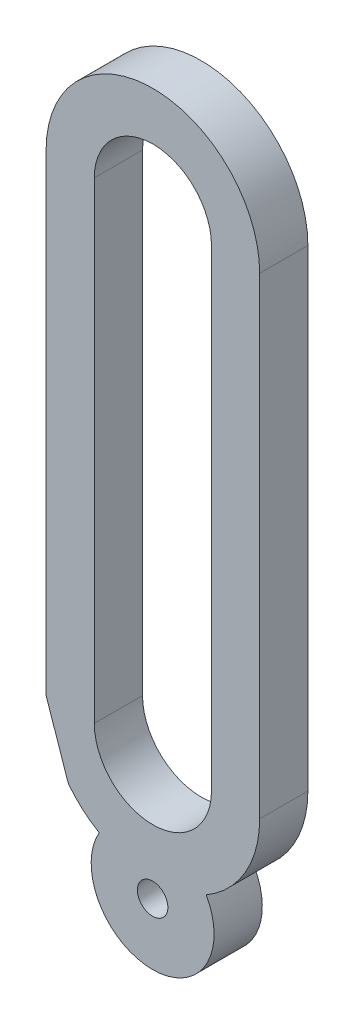
ISO-10303-21;
HEADER;
FILE_DESCRIPTION(('STEP AP214'),'2;1');
FILE_NAME('part.step','',(''),(''),'','','');
FILE_SCHEMA(('AUTOMOTIVE_DESIGN { 1 0 10303 214 1 1 1 1 }'));
ENDSEC;
DATA;
#1=APPLICATION_CONTEXT('core data for automotive mechanical design processes');
#2=APPLICATION_PROTOCOL_DEFINITION('international standard','automotive_design',2000,#1);
#3=PRODUCT_CONTEXT('',#1,'mechanical');
#4=PRODUCT('Part','Part','',(#3));
#5=PRODUCT_RELATED_PRODUCT_CATEGORY('part','',(#4));
#6=PRODUCT_DEFINITION_FORMATION('','',#4);
#7=PRODUCT_DEFINITION_CONTEXT('part definition',#1,'design');
#8=PRODUCT_DEFINITION('design','',#6,#7);
#9=PRODUCT_DEFINITION_SHAPE('','',#8);
#10=(LENGTH_UNIT() NAMED_UNIT(*) SI_UNIT(.MILLI.,.METRE.));
#11=(NAMED_UNIT(*) PLANE_ANGLE_UNIT() SI_UNIT($,.RADIAN.));
#12=(NAMED_UNIT(*) SI_UNIT($,.STERADIAN.) SOLID_ANGLE_UNIT());
#13=UNCERTAINTY_MEASURE_WITH_UNIT(LENGTH_MEASURE(1.E-05),#10,'distance_accuracy_value','');
#14=(GEOMETRIC_REPRESENTATION_CONTEXT(3) GLOBAL_UNCERTAINTY_ASSIGNED_CONTEXT((#13)) GLOBAL_UNIT_ASSIGNED_CONTEXT((#10,
#11,#12)) REPRESENTATION_CONTEXT('',''));
#15=CARTESIAN_POINT('',(0.,0.,0.));
#16=DIRECTION('',(0.,0.,1.));
#17=DIRECTION('',(1.,0.,0.));
#18=AXIS2_PLACEMENT_3D('',#15,#16,#17);
#19=CARTESIAN_POINT('',(0.,-48.9994749124854,10.));
#20=DIRECTION('',(0.,0.,-1.));
#21=DIRECTION('',(-1.,0.,0.));
#22=AXIS2_PLACEMENT_3D('',#19,#20,#21);
#23=CYLINDRICAL_SURFACE('',#22,22.150088511335);
#24=CARTESIAN_POINT('',(0.,-48.9994749124854,0.));
#25=DIRECTION('',(0.,0.,1.));
#26=DIRECTION('',(1.,0.,0.));
#27=AXIS2_PLACEMENT_3D('',#24,#25,#26);
#28=CIRCLE('',#27,22.150088511335);
#29=CARTESIAN_POINT('',(-17.5309129763262,-62.5380683134429,0.));
#30=VERTEX_POINT('',#29);
#31=CARTESIAN_POINT('',(-11.1413731473858,-68.1435660491961,0.));
#32=VERTEX_POINT('',#31);
#33=EDGE_CURVE('E155',#30,#32,#28,.T.);
#34=ORIENTED_EDGE('',*,*,#33,.T.);
#35=DIRECTION('',(0.,0.,1.));
#36=VECTOR('',#35,1.);
#37=CARTESIAN_POINT('',(-11.1413731473858,-68.1435660491961,5.));
#38=LINE('',#37,#36);
#39=CARTESIAN_POINT('',(-11.1413731473858,-68.1435660491961,10.));
#40=VERTEX_POINT('',#39);
#41=EDGE_CURVE('E12',#32,#40,#38,.T.);
#42=ORIENTED_EDGE('',*,*,#41,.T.);
#43=CARTESIAN_POINT('',(0.,-48.9994749124854,10.));
#44=DIRECTION('',(0.,0.,1.));
#45=DIRECTION('',(1.,0.,0.));
#46=AXIS2_PLACEMENT_3D('',#43,#44,#45);
#47=CIRCLE('',#46,22.150088511335);
#48=CARTESIAN_POINT('',(-17.5309129763262,-62.5380683134429,10.));
#49=VERTEX_POINT('',#48);
#50=EDGE_CURVE('E153',#49,#40,#47,.T.);
#51=ORIENTED_EDGE('',*,*,#50,.F.);
#52=DIRECTION('',(0.,0.,1.));
#53=VECTOR('',#52,1.);
#54=CARTESIAN_POINT('',(-17.5309129763262,-62.5380683134429,0.));
#55=LINE('',#54,#53);
#56=EDGE_CURVE('E226',#30,#49,#55,.T.);
#57=ORIENTED_EDGE('',*,*,#56,.F.);
#58=EDGE_LOOP('',(#34,#42,#51,#57));
#59=FACE_BOUND('',#58,.T.);
#60=ADVANCED_FACE('F61',(#59),#23,.T.);
#61=CARTESIAN_POINT('',(0.,-48.9994749124854,10.));
#62=DIRECTION('',(0.,0.,1.));
#63=DIRECTION('',(1.,0.,0.));
#64=AXIS2_PLACEMENT_3D('',#61,#62,#63);
#65=PLANE('',#64);
#66=ORIENTED_EDGE('',*,*,#50,.T.);
#67=CARTESIAN_POINT('',(-0.0586195197286588,-74.4471421793505,10.));
#68=DIRECTION('',(0.,0.,1.));
#69=DIRECTION('',(1.,0.,0.));
#70=AXIS2_PLACEMENT_3D('',#67,#68,#69);
#71=CIRCLE('',#70,12.75);
#72=CARTESIAN_POINT('',(11.0530573190714,-68.1946916333587,10.));
#73=VERTEX_POINT('',#72);
#74=EDGE_CURVE('E76',#40,#73,#71,.T.);
#75=ORIENTED_EDGE('',*,*,#74,.T.);
#76=CARTESIAN_POINT('',(22.150088511335,-48.9994749124854,10.));
#77=VERTEX_POINT('',#76);
#78=EDGE_CURVE('E162',#73,#77,#47,.T.);
#79=ORIENTED_EDGE('',*,*,#78,.T.);
#80=DIRECTION('',(0.,1.,0.));
#81=VECTOR('',#80,1.);
#82=CARTESIAN_POINT('',(22.150088511335,-48.9994749124854,10.));
#83=LINE('',#82,#81);
#84=CARTESIAN_POINT('',(22.150088511335,48.9994749124854,10.));
#85=VERTEX_POINT('',#84);
#86=EDGE_CURVE('E161',#77,#85,#83,.T.);
#87=ORIENTED_EDGE('',*,*,#86,.T.);
#88=CARTESIAN_POINT('',(0.,48.9994749124854,10.));
#89=DIRECTION('',(0.,0.,1.));
#90=DIRECTION('',(1.,0.,0.));
#91=AXIS2_PLACEMENT_3D('',#88,#89,#90);
#92=CIRCLE('',#91,22.150088511335);
#93=CARTESIAN_POINT('',(-22.150088511335,48.9994749124854,10.));
#94=VERTEX_POINT('',#93);
#95=EDGE_CURVE('E164',#85,#94,#92,.T.);
#96=ORIENTED_EDGE('',*,*,#95,.T.);
#97=DIRECTION('',(0.,-1.,0.));
#98=VECTOR('',#97,1.);
#99=CARTESIAN_POINT('',(-22.150088511335,-48.9994749124854,10.));
#100=LINE('',#99,#98);
#101=CARTESIAN_POINT('',(-22.150088511335,-48.9994749124854,10.));
#102=VERTEX_POINT('',#101);
#103=EDGE_CURVE('E172',#94,#102,#100,.T.);
#104=ORIENTED_EDGE('',*,*,#103,.T.);
#105=DIRECTION('',(-0.322908518688768,0.946430181554998,0.));
#106=VECTOR('',#105,1.);
#107=CARTESIAN_POINT('',(-22.150088511335,-48.9994749124854,10.));
#108=LINE('',#107,#106);
#109=EDGE_CURVE('E160',#49,#102,#108,.T.);
#110=ORIENTED_EDGE('',*,*,#109,.F.);
#111=EDGE_LOOP('',(#66,#75,#79,#87,#96,#104,#110));
#112=FACE_BOUND('',#111,.T.);
#113=DIRECTION('',(0.,1.,0.));
#114=VECTOR('',#113,1.);
#115=CARTESIAN_POINT('',(12.150088511335,-48.9994749124854,10.));
#116=LINE('',#115,#114);
#117=CARTESIAN_POINT('',(12.150088511335,-48.9994749124854,10.));
#118=VERTEX_POINT('',#117);
#119=CARTESIAN_POINT('',(12.150088511335,48.9994749124854,10.));
#120=VERTEX_POINT('',#119);
#121=EDGE_CURVE('E230',#118,#120,#116,.T.);
#122=ORIENTED_EDGE('',*,*,#121,.F.);
#123=CARTESIAN_POINT('',(0.,-48.9994749124854,10.));
#124=DIRECTION('',(0.,0.,1.));
#125=DIRECTION('',(1.,0.,0.));
#126=AXIS2_PLACEMENT_3D('',#123,#124,#125);
#127=CIRCLE('',#126,12.150088511335);
#128=CARTESIAN_POINT('',(-12.150088511335,-48.9994749124854,10.));
#129=VERTEX_POINT('',#128);
#130=EDGE_CURVE('E217',#129,#118,#127,.T.);
#131=ORIENTED_EDGE('',*,*,#130,.F.);
#132=DIRECTION('',(0.,-1.,0.));
#133=VECTOR('',#132,1.);
#134=CARTESIAN_POINT('',(-12.150088511335,-48.9994749124854,10.));
#135=LINE('',#134,#133);
#136=CARTESIAN_POINT('',(-12.150088511335,48.9994749124854,10.));
#137=VERTEX_POINT('',#136);
#138=EDGE_CURVE('E213',#137,#129,#135,.T.);
#139=ORIENTED_EDGE('',*,*,#138,.F.);
#140=CARTESIAN_POINT('',(0.,48.9994749124854,10.));
#141=DIRECTION('',(0.,0.,1.));
#142=DIRECTION('',(1.,0.,0.));
#143=AXIS2_PLACEMENT_3D('',#140,#141,#142);
#144=CIRCLE('',#143,12.150088511335);
#145=EDGE_CURVE('E228',#120,#137,#144,.T.);
#146=ORIENTED_EDGE('',*,*,#145,.F.);
#147=EDGE_LOOP('',(#122,#131,#139,#146));
#148=FACE_BOUND('',#147,.T.);
#149=CARTESIAN_POINT('',(-0.0586195197286588,-74.4471421793505,10.));
#150=DIRECTION('',(0.,0.,1.));
#151=DIRECTION('',(1.,0.,0.));
#152=AXIS2_PLACEMENT_3D('',#149,#150,#151);
#153=CIRCLE('',#152,3.16156204082582);
#154=CARTESIAN_POINT('',(3.10294252109716,-74.4471421793505,10.));
#155=VERTEX_POINT('',#154);
#156=EDGE_CURVE('E239',#155,#155,#153,.T.);
#157=ORIENTED_EDGE('',*,*,#156,.F.);
#158=EDGE_LOOP('',(#157));
#159=FACE_BOUND('',#158,.T.);
#160=ADVANCED_FACE('F157',(#112,#148,#159),#65,.T.);
#161=CARTESIAN_POINT('',(0.,-48.9994749124854,0.));
#162=DIRECTION('',(0.,0.,1.));
#163=DIRECTION('',(1.,0.,0.));
#164=AXIS2_PLACEMENT_3D('',#161,#162,#163);
#165=PLANE('',#164);
#166=CARTESIAN_POINT('',(11.0530573190714,-68.1946916333587,0.));
#167=VERTEX_POINT('',#166);
#168=CARTESIAN_POINT('',(22.150088511335,-48.9994749124854,0.));
#169=VERTEX_POINT('',#168);
#170=EDGE_CURVE('E177',#167,#169,#28,.T.);
#171=ORIENTED_EDGE('',*,*,#170,.F.);
#172=CARTESIAN_POINT('',(-0.0586195197286588,-74.4471421793505,0.));
#173=DIRECTION('',(0.,0.,1.));
#174=DIRECTION('',(1.,0.,0.));
#175=AXIS2_PLACEMENT_3D('',#172,#173,#174);
#176=CIRCLE('',#175,12.75);
#177=EDGE_CURVE('E146',#32,#167,#176,.T.);
#178=ORIENTED_EDGE('',*,*,#177,.F.);
#179=ORIENTED_EDGE('',*,*,#33,.F.);
#180=DIRECTION('',(-0.322908518688768,0.946430181554998,0.));
#181=VECTOR('',#180,1.);
#182=CARTESIAN_POINT('',(-22.150088511335,-48.9994749124854,0.));
#183=LINE('',#182,#181);
#184=CARTESIAN_POINT('',(-22.150088511335,-48.9994749124854,0.));
#185=VERTEX_POINT('',#184);
#186=EDGE_CURVE('E234',#30,#185,#183,.T.);
#187=ORIENTED_EDGE('',*,*,#186,.T.);
#188=DIRECTION('',(0.,-1.,0.));
#189=VECTOR('',#188,1.);
#190=CARTESIAN_POINT('',(-22.150088511335,-48.9994749124854,0.));
#191=LINE('',#190,#189);
#192=CARTESIAN_POINT('',(-22.150088511335,48.9994749124854,0.));
#193=VERTEX_POINT('',#192);
#194=EDGE_CURVE('E166',#193,#185,#191,.T.);
#195=ORIENTED_EDGE('',*,*,#194,.F.);
#196=CARTESIAN_POINT('',(0.,48.9994749124854,0.));
#197=DIRECTION('',(0.,0.,1.));
#198=DIRECTION('',(1.,0.,0.));
#199=AXIS2_PLACEMENT_3D('',#196,#197,#198);
#200=CIRCLE('',#199,22.150088511335);
#201=CARTESIAN_POINT('',(22.150088511335,48.9994749124854,0.));
#202=VERTEX_POINT('',#201);
#203=EDGE_CURVE('E179',#202,#193,#200,.T.);
#204=ORIENTED_EDGE('',*,*,#203,.F.);
#205=DIRECTION('',(0.,1.,0.));
#206=VECTOR('',#205,1.);
#207=CARTESIAN_POINT('',(22.150088511335,-48.9994749124854,0.));
#208=LINE('',#207,#206);
#209=EDGE_CURVE('E176',#169,#202,#208,.T.);
#210=ORIENTED_EDGE('',*,*,#209,.F.);
#211=EDGE_LOOP('',(#171,#178,#179,#187,#195,#204,#210));
#212=FACE_BOUND('',#211,.T.);
#213=CARTESIAN_POINT('',(0.,-48.9994749124854,0.));
#214=DIRECTION('',(0.,0.,1.));
#215=DIRECTION('',(1.,0.,0.));
#216=AXIS2_PLACEMENT_3D('',#213,#214,#215);
#217=CIRCLE('',#216,12.150088511335);
#218=CARTESIAN_POINT('',(-12.150088511335,-48.9994749124854,0.));
#219=VERTEX_POINT('',#218);
#220=CARTESIAN_POINT('',(12.150088511335,-48.9994749124854,0.));
#221=VERTEX_POINT('',#220);
#222=EDGE_CURVE('E224',#219,#221,#217,.T.);
#223=ORIENTED_EDGE('',*,*,#222,.T.);
#224=DIRECTION('',(0.,1.,0.));
#225=VECTOR('',#224,1.);
#226=CARTESIAN_POINT('',(12.150088511335,-48.9994749124854,0.));
#227=LINE('',#226,#225);
#228=CARTESIAN_POINT('',(12.150088511335,48.9994749124854,0.));
#229=VERTEX_POINT('',#228);
#230=EDGE_CURVE('E221',#221,#229,#227,.T.);
#231=ORIENTED_EDGE('',*,*,#230,.T.);
#232=CARTESIAN_POINT('',(0.,48.9994749124854,0.));
#233=DIRECTION('',(0.,0.,1.));
#234=DIRECTION('',(1.,0.,0.));
#235=AXIS2_PLACEMENT_3D('',#232,#233,#234);
#236=CIRCLE('',#235,12.150088511335);
#237=CARTESIAN_POINT('',(-12.150088511335,48.9994749124854,0.));
#238=VERTEX_POINT('',#237);
#239=EDGE_CURVE('E218',#229,#238,#236,.T.);
#240=ORIENTED_EDGE('',*,*,#239,.T.);
#241=DIRECTION('',(0.,-1.,0.));
#242=VECTOR('',#241,1.);
#243=CARTESIAN_POINT('',(-12.150088511335,-48.9994749124854,0.));
#244=LINE('',#243,#242);
#245=EDGE_CURVE('E214',#238,#219,#244,.T.);
#246=ORIENTED_EDGE('',*,*,#245,.T.);
#247=EDGE_LOOP('',(#223,#231,#240,#246));
#248=FACE_BOUND('',#247,.T.);
#249=CARTESIAN_POINT('',(-0.0586195197286588,-74.4471421793505,0.));
#250=DIRECTION('',(0.,0.,1.));
#251=DIRECTION('',(1.,0.,0.));
#252=AXIS2_PLACEMENT_3D('',#249,#250,#251);
#253=CIRCLE('',#252,3.16156204082582);
#254=CARTESIAN_POINT('',(3.10294252109716,-74.4471421793505,0.));
#255=VERTEX_POINT('',#254);
#256=EDGE_CURVE('E147',#255,#255,#253,.T.);
#257=ORIENTED_EDGE('',*,*,#256,.T.);
#258=EDGE_LOOP('',(#257));
#259=FACE_BOUND('',#258,.T.);
#260=ADVANCED_FACE('F197',(#212,#248,#259),#165,.F.);
#261=ORIENTED_EDGE('',*,*,#78,.F.);
#262=DIRECTION('',(0.,0.,1.));
#263=VECTOR('',#262,1.);
#264=CARTESIAN_POINT('',(11.0530573190714,-68.1946916333587,5.));
#265=LINE('',#264,#263);
#266=EDGE_CURVE('E69',#73,#167,#265,.F.);
#267=ORIENTED_EDGE('',*,*,#266,.T.);
#268=ORIENTED_EDGE('',*,*,#170,.T.);
#269=DIRECTION('',(0.,0.,-1.));
#270=VECTOR('',#269,1.);
#271=CARTESIAN_POINT('',(22.150088511335,-48.9994749124854,10.));
#272=LINE('',#271,#270);
#273=EDGE_CURVE('E190',#77,#169,#272,.T.);
#274=ORIENTED_EDGE('',*,*,#273,.F.);
#275=EDGE_LOOP('',(#261,#267,#268,#274));
#276=FACE_BOUND('',#275,.T.);
#277=ADVANCED_FACE('F63',(#276),#23,.T.);
#278=CARTESIAN_POINT('',(22.150088511335,-48.9994749124854,10.));
#279=DIRECTION('',(-1.,0.,0.));
#280=DIRECTION('',(0.,0.,1.));
#281=AXIS2_PLACEMENT_3D('',#278,#279,#280);
#282=PLANE('',#281);
#283=ORIENTED_EDGE('',*,*,#209,.T.);
#284=DIRECTION('',(0.,0.,-1.));
#285=VECTOR('',#284,1.);
#286=CARTESIAN_POINT('',(22.150088511335,48.9994749124854,10.));
#287=LINE('',#286,#285);
#288=EDGE_CURVE('E187',#85,#202,#287,.T.);
#289=ORIENTED_EDGE('',*,*,#288,.F.);
#290=ORIENTED_EDGE('',*,*,#86,.F.);
#291=ORIENTED_EDGE('',*,*,#273,.T.);
#292=EDGE_LOOP('',(#283,#289,#290,#291));
#293=FACE_BOUND('',#292,.T.);
#294=ADVANCED_FACE('F269',(#293),#282,.F.);
#295=CARTESIAN_POINT('',(0.,48.9994749124854,10.));
#296=DIRECTION('',(0.,0.,-1.));
#297=DIRECTION('',(-1.,0.,0.));
#298=AXIS2_PLACEMENT_3D('',#295,#296,#297);
#299=CYLINDRICAL_SURFACE('',#298,22.150088511335);
#300=ORIENTED_EDGE('',*,*,#203,.T.);
#301=DIRECTION('',(0.,0.,-1.));
#302=VECTOR('',#301,1.);
#303=CARTESIAN_POINT('',(-22.150088511335,48.9994749124854,10.));
#304=LINE('',#303,#302);
#305=EDGE_CURVE('E184',#94,#193,#304,.T.);
#306=ORIENTED_EDGE('',*,*,#305,.F.);
#307=ORIENTED_EDGE('',*,*,#95,.F.);
#308=ORIENTED_EDGE('',*,*,#288,.T.);
#309=EDGE_LOOP('',(#300,#306,#307,#308));
#310=FACE_BOUND('',#309,.T.);
#311=ADVANCED_FACE('F266',(#310),#299,.T.);
#312=CARTESIAN_POINT('',(-22.150088511335,-48.9994749124854,10.));
#313=DIRECTION('',(1.,0.,0.));
#314=DIRECTION('',(0.,0.,-1.));
#315=AXIS2_PLACEMENT_3D('',#312,#313,#314);
#316=PLANE('',#315);
#317=ORIENTED_EDGE('',*,*,#194,.T.);
#318=DIRECTION('',(0.,0.,-1.));
#319=VECTOR('',#318,1.);
#320=CARTESIAN_POINT('',(-22.150088511335,-48.9994749124854,10.));
#321=LINE('',#320,#319);
#322=EDGE_CURVE('E174',#102,#185,#321,.T.);
#323=ORIENTED_EDGE('',*,*,#322,.F.);
#324=ORIENTED_EDGE('',*,*,#103,.F.);
#325=ORIENTED_EDGE('',*,*,#305,.T.);
#326=EDGE_LOOP('',(#317,#323,#324,#325));
#327=FACE_BOUND('',#326,.T.);
#328=ADVANCED_FACE('F263',(#327),#316,.F.);
#329=CARTESIAN_POINT('',(0.,-48.9994749124854,10.));
#330=DIRECTION('',(0.,0.,-1.));
#331=DIRECTION('',(-1.,0.,0.));
#332=AXIS2_PLACEMENT_3D('',#329,#330,#331);
#333=CYLINDRICAL_SURFACE('',#332,12.150088511335);
#334=ORIENTED_EDGE('',*,*,#222,.F.);
#335=DIRECTION('',(0.,0.,-1.));
#336=VECTOR('',#335,1.);
#337=CARTESIAN_POINT('',(-12.150088511335,-48.9994749124854,10.));
#338=LINE('',#337,#336);
#339=EDGE_CURVE('E208',#129,#219,#338,.T.);
#340=ORIENTED_EDGE('',*,*,#339,.F.);
#341=ORIENTED_EDGE('',*,*,#130,.T.);
#342=DIRECTION('',(0.,0.,-1.));
#343=VECTOR('',#342,1.);
#344=CARTESIAN_POINT('',(12.150088511335,-48.9994749124854,10.));
#345=LINE('',#344,#343);
#346=EDGE_CURVE('E168',#118,#221,#345,.T.);
#347=ORIENTED_EDGE('',*,*,#346,.T.);
#348=EDGE_LOOP('',(#334,#340,#341,#347));
#349=FACE_BOUND('',#348,.T.);
#350=ADVANCED_FACE('F260',(#349),#333,.F.);
#351=CARTESIAN_POINT('',(12.150088511335,-48.9994749124854,10.));
#352=DIRECTION('',(-1.,0.,0.));
#353=DIRECTION('',(0.,0.,1.));
#354=AXIS2_PLACEMENT_3D('',#351,#352,#353);
#355=PLANE('',#354);
#356=ORIENTED_EDGE('',*,*,#230,.F.);
#357=ORIENTED_EDGE('',*,*,#346,.F.);
#358=ORIENTED_EDGE('',*,*,#121,.T.);
#359=DIRECTION('',(0.,0.,-1.));
#360=VECTOR('',#359,1.);
#361=CARTESIAN_POINT('',(12.150088511335,48.9994749124854,10.));
#362=LINE('',#361,#360);
#363=EDGE_CURVE('E201',#120,#229,#362,.T.);
#364=ORIENTED_EDGE('',*,*,#363,.T.);
#365=EDGE_LOOP('',(#356,#357,#358,#364));
#366=FACE_BOUND('',#365,.T.);
#367=ADVANCED_FACE('F297',(#366),#355,.T.);
#368=CARTESIAN_POINT('',(0.,48.9994749124854,10.));
#369=DIRECTION('',(0.,0.,-1.));
#370=DIRECTION('',(-1.,0.,0.));
#371=AXIS2_PLACEMENT_3D('',#368,#369,#370);
#372=CYLINDRICAL_SURFACE('',#371,12.150088511335);
#373=ORIENTED_EDGE('',*,*,#239,.F.);
#374=ORIENTED_EDGE('',*,*,#363,.F.);
#375=ORIENTED_EDGE('',*,*,#145,.T.);
#376=DIRECTION('',(0.,0.,-1.));
#377=VECTOR('',#376,1.);
#378=CARTESIAN_POINT('',(-12.150088511335,48.9994749124854,10.));
#379=LINE('',#378,#377);
#380=EDGE_CURVE('E84',#137,#238,#379,.T.);
#381=ORIENTED_EDGE('',*,*,#380,.T.);
#382=EDGE_LOOP('',(#373,#374,#375,#381));
#383=FACE_BOUND('',#382,.T.);
#384=ADVANCED_FACE('F293',(#383),#372,.F.);
#385=CARTESIAN_POINT('',(-12.150088511335,-48.9994749124854,10.));
#386=DIRECTION('',(1.,0.,0.));
#387=DIRECTION('',(0.,0.,-1.));
#388=AXIS2_PLACEMENT_3D('',#385,#386,#387);
#389=PLANE('',#388);
#390=ORIENTED_EDGE('',*,*,#245,.F.);
#391=ORIENTED_EDGE('',*,*,#380,.F.);
#392=ORIENTED_EDGE('',*,*,#138,.T.);
#393=ORIENTED_EDGE('',*,*,#339,.T.);
#394=EDGE_LOOP('',(#390,#391,#392,#393));
#395=FACE_BOUND('',#394,.T.);
#396=ADVANCED_FACE('F286',(#395),#389,.T.);
#397=CARTESIAN_POINT('',(-22.150088511335,-48.9994749124854,0.));
#398=DIRECTION('',(0.946430181554997,0.322908518688768,0.));
#399=DIRECTION('',(-0.322908518688768,0.946430181554997,0.));
#400=AXIS2_PLACEMENT_3D('',#397,#398,#399);
#401=PLANE('',#400);
#402=ORIENTED_EDGE('',*,*,#109,.T.);
#403=ORIENTED_EDGE('',*,*,#322,.T.);
#404=ORIENTED_EDGE('',*,*,#186,.F.);
#405=ORIENTED_EDGE('',*,*,#56,.T.);
#406=EDGE_LOOP('',(#402,#403,#404,#405));
#407=FACE_BOUND('',#406,.T.);
#408=ADVANCED_FACE('F284',(#407),#401,.F.);
#409=CARTESIAN_POINT('',(-0.0586195197286588,-74.4471421793505,0.));
#410=DIRECTION('',(0.,0.,1.));
#411=DIRECTION('',(1.,0.,0.));
#412=AXIS2_PLACEMENT_3D('',#409,#410,#411);
#413=CYLINDRICAL_SURFACE('',#412,12.75);
#414=ORIENTED_EDGE('',*,*,#41,.F.);
#415=ORIENTED_EDGE('',*,*,#177,.T.);
#416=ORIENTED_EDGE('',*,*,#266,.F.);
#417=ORIENTED_EDGE('',*,*,#74,.F.);
#418=EDGE_LOOP('',(#414,#415,#416,#417));
#419=FACE_BOUND('',#418,.T.);
#420=ADVANCED_FACE('F142',(#419),#413,.T.);
#421=CARTESIAN_POINT('',(-0.0586195197286588,-74.4471421793505,0.));
#422=DIRECTION('',(0.,0.,1.));
#423=DIRECTION('',(1.,0.,0.));
#424=AXIS2_PLACEMENT_3D('',#421,#422,#423);
#425=CYLINDRICAL_SURFACE('',#424,3.16156204082582);
#426=ORIENTED_EDGE('',*,*,#256,.F.);
#427=EDGE_LOOP('',(#426));
#428=FACE_BOUND('',#427,.T.);
#429=ORIENTED_EDGE('',*,*,#156,.T.);
#430=EDGE_LOOP('',(#429));
#431=FACE_BOUND('',#430,.T.);
#432=ADVANCED_FACE('F246',(#428,#431),#425,.F.);
#433=CLOSED_SHELL('',(#60,#160,#260,#277,#294,#311,#328,#350,#367,#384,#396,#408,#420,#432));
#434=MANIFOLD_SOLID_BREP('B2',#433);
#435=ADVANCED_BREP_SHAPE_REPRESENTATION('',(#18,#434),#14);
#436=SHAPE_DEFINITION_REPRESENTATION(#9,#435);
ENDSEC;
END-ISO-10303-21;
